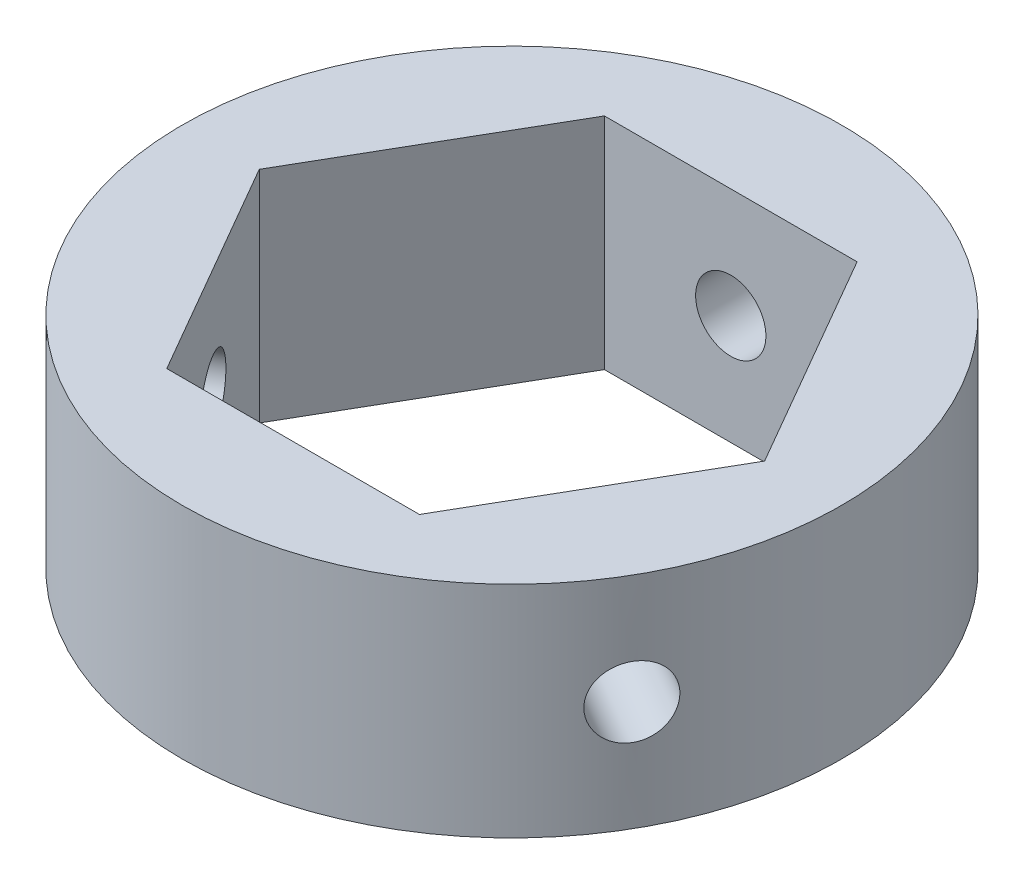
ISO-10303-21;
HEADER;
FILE_DESCRIPTION(('STEP AP214'),'2;1');
FILE_NAME('part.step','',(''),(''),'','','');
FILE_SCHEMA(('AUTOMOTIVE_DESIGN { 1 0 10303 214 1 1 1 1 }'));
ENDSEC;
DATA;
#1=APPLICATION_CONTEXT('core data for automotive mechanical design processes');
#2=APPLICATION_PROTOCOL_DEFINITION('international standard','automotive_design',2000,#1);
#3=PRODUCT_CONTEXT('',#1,'mechanical');
#4=PRODUCT('Part','Part','',(#3));
#5=PRODUCT_RELATED_PRODUCT_CATEGORY('part','',(#4));
#6=PRODUCT_DEFINITION_FORMATION('','',#4);
#7=PRODUCT_DEFINITION_CONTEXT('part definition',#1,'design');
#8=PRODUCT_DEFINITION('design','',#6,#7);
#9=PRODUCT_DEFINITION_SHAPE('','',#8);
#10=(LENGTH_UNIT() NAMED_UNIT(*) SI_UNIT(.MILLI.,.METRE.));
#11=(NAMED_UNIT(*) PLANE_ANGLE_UNIT() SI_UNIT($,.RADIAN.));
#12=(NAMED_UNIT(*) SI_UNIT($,.STERADIAN.) SOLID_ANGLE_UNIT());
#13=UNCERTAINTY_MEASURE_WITH_UNIT(LENGTH_MEASURE(1.E-05),#10,'distance_accuracy_value','');
#14=(GEOMETRIC_REPRESENTATION_CONTEXT(3) GLOBAL_UNCERTAINTY_ASSIGNED_CONTEXT((#13)) GLOBAL_UNIT_ASSIGNED_CONTEXT((#10,
#11,#12)) REPRESENTATION_CONTEXT('',''));
#15=CARTESIAN_POINT('',(0.,0.,0.));
#16=DIRECTION('',(0.,0.,1.));
#17=DIRECTION('',(1.,0.,0.));
#18=AXIS2_PLACEMENT_3D('',#15,#16,#17);
#19=CARTESIAN_POINT('',(0.,10.,0.));
#20=DIRECTION('',(0.,-1.,0.));
#21=DIRECTION('',(0.,0.,-1.));
#22=AXIS2_PLACEMENT_3D('',#19,#20,#21);
#23=CYLINDRICAL_SURFACE('',#22,15.);
#24=CARTESIAN_POINT('',(13.716268811077,5.,6.0715706289457));
#25=CARTESIAN_POINT('',(13.7162678447554,4.91040200902519,6.07157453384681));
#26=CARTESIAN_POINT('',(13.7131998564536,4.82074556882255,6.07851839780112));
#27=CARTESIAN_POINT('',(13.7009495137309,4.64392074417291,6.1060790255386));
#28=CARTESIAN_POINT('',(13.6917605065222,4.55675517461343,6.12671066613786));
#29=CARTESIAN_POINT('',(13.6673660215571,4.38749824849863,6.18093718497508));
#30=CARTESIAN_POINT('',(13.6521642978678,4.30540376269536,6.21452397428277));
#31=CARTESIAN_POINT('',(13.6159189937219,4.14855476135986,6.29353876970057));
#32=CARTESIAN_POINT('',(13.5948765337103,4.07379884176919,6.33896450461022));
#33=CARTESIAN_POINT('',(13.5471271319455,3.93342415971157,6.44037964868157));
#34=CARTESIAN_POINT('',(13.5203997101253,3.86783989326222,6.49640716797559));
#35=CARTESIAN_POINT('',(13.4617197722796,3.74796750526414,6.6171441528138));
#36=CARTESIAN_POINT('',(13.4297670123153,3.69367991135629,6.68185402365803));
#37=CARTESIAN_POINT('',(13.361106525374,3.59782135699573,6.81811246067042));
#38=CARTESIAN_POINT('',(13.3243876072305,3.55628112565101,6.88967701490332));
#39=CARTESIAN_POINT('',(13.2470012907982,3.48729311061391,7.03732165788264));
#40=CARTESIAN_POINT('',(13.206334001071,3.45984493958605,7.11340162245401));
#41=CARTESIAN_POINT('',(13.1221663194097,3.41992191766823,7.26749094433223));
#42=CARTESIAN_POINT('',(13.0786773587645,3.40739019689065,7.34549180886586));
#43=CARTESIAN_POINT('',(12.9898736360621,3.397479769565,7.50141524379234));
#44=CARTESIAN_POINT('',(12.9445589273987,3.4001006202012,7.57933781640661));
#45=CARTESIAN_POINT('',(12.8536077719863,3.42037492014872,7.7325724190174));
#46=CARTESIAN_POINT('',(12.8079733820495,3.43796721522681,7.80789377370764));
#47=CARTESIAN_POINT('',(12.7176249700482,3.48758967293255,7.95420725275729));
#48=CARTESIAN_POINT('',(12.672910961347,3.51962004503983,8.02519931428675));
#49=CARTESIAN_POINT('',(12.5858018570609,3.59727598788733,8.16113525572931));
#50=CARTESIAN_POINT('',(12.5434115508407,3.6429284735851,8.22606682456891));
#51=CARTESIAN_POINT('',(12.4625322678048,3.74651318645469,8.34809299554531));
#52=CARTESIAN_POINT('',(12.4240434213304,3.80444582368619,8.40518733587591));
#53=CARTESIAN_POINT('',(12.3522031359487,3.93128993430478,8.51041512827645));
#54=CARTESIAN_POINT('',(12.3188782282477,4.00025463118204,8.55850255231713));
#55=CARTESIAN_POINT('',(12.2588898879862,4.14702109423084,8.64420986264528));
#56=CARTESIAN_POINT('',(12.232226467408,4.22482287629787,8.68182973010406));
#57=CARTESIAN_POINT('',(12.186632030043,4.38709742349062,8.74571598596297));
#58=CARTESIAN_POINT('',(12.1677030002245,4.47157189619066,8.77197945700068));
#59=CARTESIAN_POINT('',(12.138380554958,4.64477265013014,8.81251093145445));
#60=CARTESIAN_POINT('',(12.1279868427585,4.73349878343654,8.82677935190861));
#61=CARTESIAN_POINT('',(12.1162090422473,4.91221716228972,8.84293954436857));
#62=CARTESIAN_POINT('',(12.1147809025209,5.00220103666887,8.84489183066064));
#63=CARTESIAN_POINT('',(12.1208780415679,5.18129044153566,8.83653445686697));
#64=CARTESIAN_POINT('',(12.1284031823582,5.27039598553831,8.82622498575285));
#65=CARTESIAN_POINT('',(12.1520564259819,5.44498090027206,8.79362975919915));
#66=CARTESIAN_POINT('',(12.1681637720459,5.53046848511789,8.77137289853734));
#67=CARTESIAN_POINT('',(12.2082976965739,5.695646532303,8.71542573010759));
#68=CARTESIAN_POINT('',(12.2323244805376,5.77533684414467,8.68173512564739));
#69=CARTESIAN_POINT('',(12.2874353145018,5.9269968830581,8.60355861096544));
#70=CARTESIAN_POINT('',(12.3185463044659,5.99893555228141,8.55903144559601));
#71=CARTESIAN_POINT('',(12.3865581327926,6.13273480729651,8.46030504996526));
#72=CARTESIAN_POINT('',(12.4234591344025,6.1945951088323,8.40610554699015));
#73=CARTESIAN_POINT('',(12.5018313847431,6.30673949726983,8.28910012833038));
#74=CARTESIAN_POINT('',(12.543320801138,6.35697494034909,8.22625974190163));
#75=CARTESIAN_POINT('',(12.6292480487266,6.44410842820421,8.09372118645029));
#76=CARTESIAN_POINT('',(12.6736858347137,6.48100667742005,8.02402312256686));
#77=CARTESIAN_POINT('',(12.7638933041883,6.54033646050466,7.87973642057734));
#78=CARTESIAN_POINT('',(12.8096601163803,6.56279706220758,7.80515794424808));
#79=CARTESIAN_POINT('',(12.9011333690097,6.59270877323548,7.65301459820634));
#80=CARTESIAN_POINT('',(12.9468398113466,6.60016036667508,7.57544982489894));
#81=CARTESIAN_POINT('',(13.0365978415722,6.5998351884965,7.41991505653984));
#82=CARTESIAN_POINT('',(13.0806565161107,6.59213380438842,7.3419489825624));
#83=CARTESIAN_POINT('',(13.1661646534449,6.56187975717421,7.18748247547159));
#84=CARTESIAN_POINT('',(13.2076141150085,6.53932708705545,7.11098204305029));
#85=CARTESIAN_POINT('',(13.2868961989133,6.48003225255141,6.96171930471675));
#86=CARTESIAN_POINT('',(13.3247294724526,6.44329264895786,6.88895632686478));
#87=CARTESIAN_POINT('',(13.3959919699902,6.35667477609158,6.74933702674084));
#88=CARTESIAN_POINT('',(13.4294212003003,6.30679652564899,6.68248069600373));
#89=CARTESIAN_POINT('',(13.4914206597889,6.1950352504844,6.55641177052307));
#90=CARTESIAN_POINT('',(13.5199669329959,6.13309605795611,6.49723718624372));
#91=CARTESIAN_POINT('',(13.5715668310967,5.99908402620221,6.38875514320365));
#92=CARTESIAN_POINT('',(13.5946191410206,5.92700876747841,6.33945004713811));
#93=CARTESIAN_POINT('',(13.6349715382365,5.77454180865087,6.25218969922929));
#94=CARTESIAN_POINT('',(13.6522550088522,5.69412694429036,6.21426726529693));
#95=CARTESIAN_POINT('',(13.6807605469919,5.5274798834738,6.15125984298096));
#96=CARTESIAN_POINT('',(13.6919893923532,5.4412543140037,6.12616050147389));
#97=CARTESIAN_POINT('',(13.7055088194197,5.2954586152445,6.09583396911073));
#98=CARTESIAN_POINT('',(13.7095413440927,5.23681777309935,6.08674960461534));
#99=CARTESIAN_POINT('',(13.7149216536417,5.11879318406104,6.07461665487275));
#100=CARTESIAN_POINT('',(13.7162694518126,5.05940944084826,6.07156803973596));
#101=CARTESIAN_POINT('',(13.716268811077,5.,6.0715706289457));
#102=B_SPLINE_CURVE_WITH_KNOTS('',3,(#24,#25,#26,#27,#28,#29,#30,#31,#32,#33,#34,#35,#36,#37,
#38,#39,#40,#41,#42,#43,#44,#45,#46,#47,#48,#49,#50,#51,#52,#53,#54,#55,#56,#57,#58,#59,#60,#61,
#62,#63,#64,#65,#66,#67,#68,#69,#70,#71,#72,#73,#74,#75,#76,#77,#78,#79,#80,#81,#82,#83,#84,#85,
#86,#87,#88,#89,#90,#91,#92,#93,#94,#95,#96,#97,#98,#99,#100,#101),.UNSPECIFIED.,.T.,.F.,(4,2,2,
2,2,2,2,2,2,2,2,2,2,2,2,2,2,2,2,2,2,2,2,2,2,2,2,2,2,2,2,2,2,2,2,2,2,2,4),(0.,0.268577001529121,
0.537446390261957,0.806148173479048,1.07479844645295,1.34443343913402,1.61408102300266,
1.88437361023824,2.15465876779301,2.42391011167974,2.69315358705865,2.96130252668384,
3.2294553569622,3.49814155961668,3.76683673567384,4.0368696427364,4.30690303552162,
4.57700575645424,4.84709908619821,5.11586429481954,5.3846253614294,5.65273933841568,
5.92086027317745,6.19001837516277,6.45918406732221,6.72945648996834,6.99972476955155,
7.26944718972391,7.5391609098771,7.80753617116475,8.07591155917665,8.34423852710794,
8.6125651104786,8.88217254048791,9.15184443588202,9.42228652782288,9.69242524206734,
9.87051058001087,10.0485950360567),.UNSPECIFIED.);
#103=CARTESIAN_POINT('',(13.716268811077,5.,6.0715706289457));
#104=VERTEX_POINT('',#103);
#105=EDGE_CURVE('E157',#104,#104,#102,.T.);
#106=ORIENTED_EDGE('',*,*,#105,.T.);
#107=EDGE_LOOP('',(#106));
#108=FACE_BOUND('',#107,.T.);
#109=CARTESIAN_POINT('',(0.,6.6,-15.));
#110=CARTESIAN_POINT('',(-0.0895996258363296,6.59999613655217,-14.9999989077891));
#111=CARTESIAN_POINT('',(-0.179257695847454,6.59244831368327,-14.9991886728086));
#112=CARTESIAN_POINT('',(-0.356085906710567,6.56245378538801,-14.9960344014634));
#113=CARTESIAN_POINT('',(-0.443253233957272,6.53999087554986,-14.9936886969358));
#114=CARTESIAN_POINT('',(-0.612513877047086,6.48082951205622,-14.9877281443057));
#115=CARTESIAN_POINT('',(-0.694610307255972,6.44413989877648,-14.9841140844827));
#116=CARTESIAN_POINT('',(-0.851462567730018,6.3575843319251,-14.9760204055693));
#117=CARTESIAN_POINT('',(-0.926219804467191,6.30772090974961,-14.9715409528118));
#118=CARTESIAN_POINT('',(-1.06659300399931,6.19601574013731,-14.9621974912335));
#119=CARTESIAN_POINT('',(-1.13217488683966,6.13413127392194,-14.9573321486968));
#120=CARTESIAN_POINT('',(-1.25204267306383,6.00023200984404,-14.9477762215508));
#121=CARTESIAN_POINT('',(-1.30632804149334,5.92821673250043,-14.9430856452263));
#122=CARTESIAN_POINT('',(-1.40218426488646,5.77588453543441,-14.9343968648937));
#123=CARTESIAN_POINT('',(-1.44372398305559,5.69554791699697,-14.9304003666382));
#124=CARTESIAN_POINT('',(-1.51271092874899,5.52898979671223,-14.9235690950951));
#125=CARTESIAN_POINT('',(-1.5401585496526,5.44276845921236,-14.9207342893794));
#126=CARTESIAN_POINT('',(-1.58008042762114,5.26723776868191,-14.9165596344694));
#127=CARTESIAN_POINT('',(-1.59261150456498,5.17794147566983,-14.9152141136969));
#128=CARTESIAN_POINT('',(-1.6025202691514,4.99850383771656,-14.9141528417841));
#129=CARTESIAN_POINT('',(-1.59989840661938,4.90836251793988,-14.9144370422643));
#130=CARTESIAN_POINT('',(-1.57962250102191,4.7301863346092,-14.9165979183767));
#131=CARTESIAN_POINT('',(-1.56203063092426,4.64214430482136,-14.9184680074354));
#132=CARTESIAN_POINT('',(-1.51241088377974,4.47026943307365,-14.9235796666885));
#133=CARTESIAN_POINT('',(-1.48038278761355,4.38643665502511,-14.9268212577002));
#134=CARTESIAN_POINT('',(-1.40273156459364,4.22516438723151,-14.934318231731));
#135=CARTESIAN_POINT('',(-1.35708099297873,4.14773821074337,-14.9385756578166));
#136=CARTESIAN_POINT('',(-1.25350036927722,4.00162272366845,-14.9476229120459));
#137=CARTESIAN_POINT('',(-1.19556990805871,3.93293370430156,-14.9524127579258));
#138=CARTESIAN_POINT('',(-1.06872734530803,3.80588117566733,-14.9620144963827));
#139=CARTESIAN_POINT('',(-0.999761574904382,3.74757123241306,-14.9668263789258));
#140=CARTESIAN_POINT('',(-0.852992050794658,3.64334770283242,-14.9759073641043));
#141=CARTESIAN_POINT('',(-0.775188284988181,3.59743413347865,-14.9801764659965));
#142=CARTESIAN_POINT('',(-0.612913191276046,3.51930828319763,-14.9876925654949));
#143=CARTESIAN_POINT('',(-0.528440469342861,3.4870988759216,-14.9909393486921));
#144=CARTESIAN_POINT('',(-0.355243522280946,3.43733571215953,-14.9960428703375));
#145=CARTESIAN_POINT('',(-0.266519441977571,3.41978145681077,-14.997899656101));
#146=CARTESIAN_POINT('',(-0.087802032562715,3.39989521302742,-15.0000078792333));
#147=CARTESIAN_POINT('',(0.0021829870137167,3.39748933901274,-15.0002671084835));
#148=CARTESIAN_POINT('',(0.181274940101574,3.40777386604083,-14.999171939422));
#149=CARTESIAN_POINT('',(0.270381887120156,3.42046403449854,-14.9978175659711));
#150=CARTESIAN_POINT('',(0.444973854329872,3.4605191002134,-14.9936523243633));
#151=CARTESIAN_POINT('',(0.530466936374454,3.48784924657705,-14.9908449058284));
#152=CARTESIAN_POINT('',(0.695655329486703,3.55637265126685,-14.9840883583372));
#153=CARTESIAN_POINT('',(0.775350493687461,3.59756626061943,-14.9801392004722));
#154=CARTESIAN_POINT('',(0.927013863040388,3.69282939323977,-14.9715211164958));
#155=CARTESIAN_POINT('',(0.99895153717134,3.74694727694824,-14.9668495108193));
#156=CARTESIAN_POINT('',(1.13274844352509,3.86645363809374,-14.9573189019738));
#157=CARTESIAN_POINT('',(1.19460738709631,3.93184243821585,-14.9524598934425));
#158=CARTESIAN_POINT('',(1.30674880643155,4.07235764059253,-14.9430785249007));
#159=CARTESIAN_POINT('',(1.35698266951906,4.14752295105724,-14.9385576302351));
#160=CARTESIAN_POINT('',(1.44411338577527,4.30526636871053,-14.930387126785));
#161=CARTESIAN_POINT('',(1.48101044283187,4.38784436255281,-14.9267375046811));
#162=CARTESIAN_POINT('',(1.54033944502694,4.5579047716626,-14.9207321507796));
#163=CARTESIAN_POINT('',(1.56279994139129,4.64537713235757,-14.9183738664767));
#164=CARTESIAN_POINT('',(1.5927107304462,4.82287819210992,-14.915210437379));
#165=CARTESIAN_POINT('',(1.60016151850103,4.91290680670399,-14.9144052413278));
#166=CARTESIAN_POINT('',(1.59983397632685,5.09248152727686,-14.9144403420788));
#167=CARTESIAN_POINT('',(1.59213200890153,5.18202778389634,-14.9152723879508));
#168=CARTESIAN_POINT('',(1.56187808941871,5.35854626255166,-14.9184705939872));
#169=CARTESIAN_POINT('',(1.53932612386707,5.44551848224841,-14.9208367555458));
#170=CARTESIAN_POINT('',(1.48003415917889,5.61441712017421,-14.9268342337211));
#171=CARTESIAN_POINT('',(1.44329676336001,5.69634446104522,-14.9304653181866));
#172=CARTESIAN_POINT('',(1.35668450936541,5.85288272448499,-14.9385839617066));
#173=CARTESIAN_POINT('',(1.30680966569268,5.92749365513053,-14.9430715198156));
#174=CARTESIAN_POINT('',(1.19505215510916,6.06767240790912,-14.9524245860808));
#175=CARTESIAN_POINT('',(1.1331125400443,6.13319471474542,-14.9572918183519));
#176=CARTESIAN_POINT('',(0.999098641616504,6.25294766925808,-14.9668401736096));
#177=CARTESIAN_POINT('',(0.927021944358041,6.30717561981006,-14.9715212519268));
#178=CARTESIAN_POINT('',(0.774553795891812,6.4029240243546,-14.980183875197));
#179=CARTESIAN_POINT('',(0.694139439921302,6.44440816203731,-14.9841634074549));
#180=CARTESIAN_POINT('',(0.527493453773448,6.51322824269229,-14.9909531584395));
#181=CARTESIAN_POINT('',(0.441268447110539,6.54057999670216,-14.993764683217));
#182=CARTESIAN_POINT('',(0.295470974664233,6.5736051144877,-14.99720217104));
#183=CARTESIAN_POINT('',(0.23682766491673,6.58348950307229,-14.9982464112777));
#184=CARTESIAN_POINT('',(0.118798133247348,6.59668821077964,-14.9996456861983));
#185=CARTESIAN_POINT('',(0.0594119149318298,6.6000025617834,-15.0000007242256));
#186=CARTESIAN_POINT('',(0.,6.6,-15.));
#187=B_SPLINE_CURVE_WITH_KNOTS('',3,(#109,#110,#111,#112,#113,#114,#115,#116,#117,#118,#119,
#120,#121,#122,#123,#124,#125,#126,#127,#128,#129,#130,#131,#132,#133,#134,#135,#136,#137,#138,
#139,#140,#141,#142,#143,#144,#145,#146,#147,#148,#149,#150,#151,#152,#153,#154,#155,#156,#157,
#158,#159,#160,#161,#162,#163,#164,#165,#166,#167,#168,#169,#170,#171,#172,#173,#174,#175,#176,
#177,#178,#179,#180,#181,#182,#183,#184,#185,#186),.UNSPECIFIED.,.T.,.F.,(4,2,2,2,2,2,2,2,2,2,2,
2,2,2,2,2,2,2,2,2,2,2,2,2,2,2,2,2,2,2,2,2,2,2,2,2,2,2,4),(0.,0.268581912434583,
0.537456102668156,0.80616348338273,1.07481926848528,1.3444478343109,1.61408916568093,
1.88438406286665,2.15467141438986,2.42392586261099,2.69317231787025,2.96130597431384,
3.22944370074354,3.49812532525549,3.76681590290194,4.03685533070423,4.30689512823114,
4.57699152303085,4.84707872334928,5.11584755786575,5.38461225150832,5.65274178759604,
5.92087811330302,6.19003392913605,6.45919745215019,6.72946698035851,6.99973237661693,
7.26946161011746,7.53918194161856,7.80754649023397,8.07591128271147,8.34422684813032,
8.61254211734561,8.88215600074883,9.15183419507823,9.42227391655059,9.69241041656318,
9.87050315987931,10.048595039001),.UNSPECIFIED.);
#188=CARTESIAN_POINT('',(0.,6.6,-15.));
#189=VERTEX_POINT('',#188);
#190=EDGE_CURVE('E154',#189,#189,#187,.T.);
#191=ORIENTED_EDGE('',*,*,#190,.T.);
#192=EDGE_LOOP('',(#191));
#193=FACE_BOUND('',#192,.T.);
#194=CARTESIAN_POINT('',(-12.116268811077,5.,8.84285192105596));
#195=CARTESIAN_POINT('',(-12.1162717096598,4.91040200902519,8.84284913174639));
#196=CARTESIAN_POINT('',(-12.1207512780937,4.82074556882255,8.8367202439613));
#197=CARTESIAN_POINT('',(-12.1384943104973,4.64392074417291,8.81233082208968));
#198=CARTESIAN_POINT('',(-12.1517673317736,4.55675517461343,8.79405708811171));
#199=CARTESIAN_POINT('',(-12.1865316321629,4.38749824849863,8.74581758500109));
#200=CARTESIAN_POINT('',(-12.2080177830903,4.30540376269536,8.71585911145105));
#201=CARTESIAN_POINT('',(-12.258323951124,4.14855476135986,8.64496235958389));
#202=CARTESIAN_POINT('',(-12.2871425615355,4.07379884176919,8.60402618720085));
#203=CARTESIAN_POINT('',(-12.3510959517473,3.93342415971157,8.51196642022142));
#204=CARTESIAN_POINT('',(-12.3862534958569,3.86783989326222,8.46080603430044));
#205=CARTESIAN_POINT('',(-12.4614748229802,3.74796750526414,8.34961922501444));
#206=CARTESIAN_POINT('',(-12.5015388350248,3.69367991135629,8.28959238774224));
#207=CARTESIAN_POINT('',(-12.5852118594869,3.59782135699573,8.16200144330867));
#208=CARTESIAN_POINT('',(-12.6288291223913,3.55628112565101,8.09441965028048));
#209=CARTESIAN_POINT('',(-12.7179999757279,3.48729311061391,7.95357881285507));
#210=CARTESIAN_POINT('',(-12.7635535129022,3.45984493958606,7.88031992456264));
#211=CARTESIAN_POINT('',(-12.8549149392699,3.41992191766823,7.73038391312715));
#212=CARTESIAN_POINT('',(-12.9007211891506,3.40739019689065,7.6537209361574));
#213=CARTESIAN_POINT('',(-12.9913529834911,3.397479769565,7.49885293888328));
#214=CARTESIAN_POINT('',(-13.0361785565716,3.4001006202012,7.42064796370853));
#215=CARTESIAN_POINT('',(-13.1234080374651,3.42037492014872,7.26526465131247));
#216=CARTESIAN_POINT('',(-13.165821049106,3.43796721522682,7.18808343299591));
#217=CARTESIAN_POINT('',(-13.2473580328784,3.48758967293255,7.0366826734863));
#218=CARTESIAN_POINT('',(-13.2864819572793,3.51962004503983,6.96246317528137));
#219=CARTESIAN_POINT('',(-13.3606513837129,3.59727598788733,6.81905650734735));
#220=CARTESIAN_POINT('',(-13.3956886187254,3.6429284735851,6.74987964086667));
#221=CARTESIAN_POINT('',(-13.4609267411996,3.74651318645469,6.61882304162953));
#222=CARTESIAN_POINT('',(-13.491127467101,3.80444582368619,6.55694355265504));
#223=CARTESIAN_POINT('',(-13.5463372658132,3.93128993430478,6.44211414429908));
#224=CARTESIAN_POINT('',(-13.5713197427845,4.00025463118204,6.38921021563094));
#225=CARTESIAN_POINT('',(-13.6155502806879,4.14702109423084,6.29440513386949));
#226=CARTESIAN_POINT('',(-13.6347983313051,4.22482287629787,6.25250400056764));
#227=CARTESIAN_POINT('',(-13.6673282331491,4.38709742349062,6.18107493160881));
#228=CARTESIAN_POINT('',(-13.6806085513501,4.47157189619066,6.15155017539815));
#229=CARTESIAN_POINT('',(-13.7010486152467,4.64477265013014,6.1058904556694));
#230=CARTESIAN_POINT('',(-13.7082085737321,4.73349878343654,6.08975502663792));
#231=CARTESIAN_POINT('',(-13.7163148106769,4.91221716228972,6.07147505596456));
#232=CARTESIAN_POINT('',(-13.717291470338,5.00220103666887,6.06926210753527));
#233=CARTESIAN_POINT('',(-13.7131023418473,5.18129044153566,6.0787210717372));
#234=CARTESIAN_POINT('',(-13.707936648358,5.27039598553832,6.0903927703857));
#235=CARTESIAN_POINT('',(-13.6915349759323,5.44498090027206,6.12717469352261));
#236=CARTESIAN_POINT('',(-13.6803136422226,5.53046848511789,6.15225249473247));
#237=CARTESIAN_POINT('',(-13.6519289353567,5.695646532303,6.2149830771422));
#238=CARTESIAN_POINT('',(-13.6347654080072,5.77533684414467,6.25263618465613));
#239=CARTESIAN_POINT('',(-13.5946179772953,5.9269968830581,6.33945182423378));
#240=CARTESIAN_POINT('',(-13.5716118159089,5.99893555228141,6.38865831456428));
#241=CARTESIAN_POINT('',(-13.520118163432,6.13273480729651,6.49692148346848));
#242=CARTESIAN_POINT('',(-13.491630517788,6.1945951088323,6.55597843977527));
#243=CARTESIAN_POINT('',(-13.4294869780185,6.30673949726983,6.68235350885186));
#244=CARTESIAN_POINT('',(-13.3958103151851,6.35697494034909,6.74970459065241));
#245=CARTESIAN_POINT('',(-13.3239921829776,6.44410842820421,6.89038904766709));
#246=CARTESIAN_POINT('',(-13.2858507820535,6.48100667742005,6.96372233116155));
#247=CARTESIAN_POINT('',(-13.2059985674396,6.54033646050466,7.11398764233242));
#248=CARTESIAN_POINT('',(-13.164295118459,6.56279706220758,7.1909121025056));
#249=CARTESIAN_POINT('',(-13.0782717420847,6.59270877323548,7.34620193607026));
#250=CARTESIAN_POINT('',(-13.0339518991302,6.60016036667508,7.4245672629044));
#251=CARTESIAN_POINT('',(-12.9441338536723,6.5998351884965,7.58006738145293));
#252=CARTESIAN_POINT('',(-12.8986425902438,6.59213380438842,7.6572063498491));
#253=CARTESIAN_POINT('',(-12.8076247397364,6.56187975717421,7.8084918225562));
#254=CARTESIAN_POINT('',(-12.7620981526408,6.53932708705544,7.88263832545411));
#255=CARTESIAN_POINT('',(-12.6724738713579,6.4800322525514,8.02592999334737));
#256=CARTESIAN_POINT('',(-12.6283759208528,6.44329264895786,8.09507605826671));
#257=CARTESIAN_POINT('',(-12.5430933088557,6.35667477609158,8.22660084153342));
#258=CARTESIAN_POINT('',(-12.5019086431885,6.30679652564899,8.28897956957946));
#259=CARTESIAN_POINT('',(-12.4237294808388,6.1950352504844,8.40570713925781));
#260=CARTESIAN_POINT('',(-12.386755924198,6.13309605795611,8.46001622917809));
#261=CARTESIAN_POINT('',(-12.3186076681213,5.99908402620221,8.55894407328617));
#262=CARTESIAN_POINT('',(-12.2874343573544,5.92700876747841,8.60356050732888));
#263=CARTESIAN_POINT('',(-12.2320408779303,5.77454180865086,8.68213688237593));
#264=CARTESIAN_POINT('',(-12.2078408220793,5.69412694429036,8.71606602396085));
#265=CARTESIAN_POINT('',(-12.1675275627966,5.52747988347379,8.7722562552963));
#266=CARTESIAN_POINT('',(-12.1514053181138,5.4412543140037,8.79453039138793));
#267=CARTESIAN_POINT('',(-12.1319014842119,5.2954586152445,8.82140182485374));
#268=CARTESIAN_POINT('',(-12.1260504561182,5.23681777309935,8.82943627590964));
#269=CARTESIAN_POINT('',(-12.1182331681927,5.11879318406104,8.84016223553054));
#270=CARTESIAN_POINT('',(-12.1162668891234,5.05940944084826,8.84285377055415));
#271=CARTESIAN_POINT('',(-12.116268811077,5.,8.84285192105596));
#272=B_SPLINE_CURVE_WITH_KNOTS('',3,(#194,#195,#196,#197,#198,#199,#200,#201,#202,#203,#204,
#205,#206,#207,#208,#209,#210,#211,#212,#213,#214,#215,#216,#217,#218,#219,#220,#221,#222,#223,
#224,#225,#226,#227,#228,#229,#230,#231,#232,#233,#234,#235,#236,#237,#238,#239,#240,#241,#242,
#243,#244,#245,#246,#247,#248,#249,#250,#251,#252,#253,#254,#255,#256,#257,#258,#259,#260,#261,
#262,#263,#264,#265,#266,#267,#268,#269,#270,#271),.UNSPECIFIED.,.T.,.F.,(4,2,2,2,2,2,2,2,2,2,2,
2,2,2,2,2,2,2,2,2,2,2,2,2,2,2,2,2,2,2,2,2,2,2,2,2,2,2,4),(0.,0.268577001529121,
0.537446390261957,0.806148173479049,1.07479844645295,1.34443343913402,1.61408102300266,
1.88437361023824,2.15465876779301,2.42391011167974,2.69315358705865,2.96130252668384,
3.2294553569622,3.49814155961668,3.76683673567384,4.0368696427364,4.30690303552162,
4.57700575645424,4.84709908619821,5.11586429481954,5.3846253614294,5.65273933841568,
5.92086027317745,6.19001837516276,6.45918406732221,6.72945648996834,6.99972476955155,
7.26944718972391,7.5391609098771,7.80753617116475,8.07591155917665,8.34423852710794,
8.6125651104786,8.88217254048791,9.15184443588201,9.42228652782288,9.69242524206733,
9.87051058001086,10.0485950360567),.UNSPECIFIED.);
#273=CARTESIAN_POINT('',(-12.116268811077,5.,8.84285192105596));
#274=VERTEX_POINT('',#273);
#275=EDGE_CURVE('E116',#274,#274,#272,.T.);
#276=ORIENTED_EDGE('',*,*,#275,.T.);
#277=EDGE_LOOP('',(#276));
#278=FACE_BOUND('',#277,.T.);
#279=CARTESIAN_POINT('',(0.,10.,0.));
#280=DIRECTION('',(0.,1.,0.));
#281=DIRECTION('',(0.,0.,1.));
#282=AXIS2_PLACEMENT_3D('',#279,#280,#281);
#283=CIRCLE('',#282,15.);
#284=CARTESIAN_POINT('',(0.,10.,15.));
#285=VERTEX_POINT('',#284);
#286=EDGE_CURVE('E11',#285,#285,#283,.T.);
#287=ORIENTED_EDGE('',*,*,#286,.F.);
#288=EDGE_LOOP('',(#287));
#289=FACE_BOUND('',#288,.T.);
#290=CARTESIAN_POINT('',(0.,0.,0.));
#291=DIRECTION('',(0.,1.,0.));
#292=DIRECTION('',(0.,0.,1.));
#293=AXIS2_PLACEMENT_3D('',#290,#291,#292);
#294=CIRCLE('',#293,15.);
#295=CARTESIAN_POINT('',(0.,0.,15.));
#296=VERTEX_POINT('',#295);
#297=EDGE_CURVE('E45',#296,#296,#294,.T.);
#298=ORIENTED_EDGE('',*,*,#297,.T.);
#299=EDGE_LOOP('',(#298));
#300=FACE_BOUND('',#299,.T.);
#301=ADVANCED_FACE('F36',(#108,#193,#278,#289,#300),#23,.T.);
#302=CARTESIAN_POINT('',(0.,10.,0.));
#303=DIRECTION('',(0.,1.,0.));
#304=DIRECTION('',(0.,0.,1.));
#305=AXIS2_PLACEMENT_3D('',#302,#303,#304);
#306=PLANE('',#305);
#307=DIRECTION('',(-1.,0.,0.));
#308=VECTOR('',#307,1.);
#309=CARTESIAN_POINT('',(5.75,10.,-9.95929214352105));
#310=LINE('',#309,#308);
#311=CARTESIAN_POINT('',(5.75,10.,-9.95929214352105));
#312=VERTEX_POINT('',#311);
#313=CARTESIAN_POINT('',(-5.75,10.,-9.95929214352105));
#314=VERTEX_POINT('',#313);
#315=EDGE_CURVE('E53',#312,#314,#310,.T.);
#316=ORIENTED_EDGE('',*,*,#315,.F.);
#317=DIRECTION('',(-0.5,0.,-0.866025403784439));
#318=VECTOR('',#317,1.);
#319=CARTESIAN_POINT('',(11.5,10.,0.));
#320=LINE('',#319,#318);
#321=CARTESIAN_POINT('',(11.5,10.,0.));
#322=VERTEX_POINT('',#321);
#323=EDGE_CURVE('E110',#322,#312,#320,.T.);
#324=ORIENTED_EDGE('',*,*,#323,.F.);
#325=DIRECTION('',(0.5,0.,-0.866025403784439));
#326=VECTOR('',#325,1.);
#327=CARTESIAN_POINT('',(5.75,10.,9.95929214352105));
#328=LINE('',#327,#326);
#329=CARTESIAN_POINT('',(5.75,10.,9.95929214352105));
#330=VERTEX_POINT('',#329);
#331=EDGE_CURVE('E113',#330,#322,#328,.T.);
#332=ORIENTED_EDGE('',*,*,#331,.F.);
#333=DIRECTION('',(1.,0.,0.));
#334=VECTOR('',#333,1.);
#335=CARTESIAN_POINT('',(-5.75,10.,9.95929214352105));
#336=LINE('',#335,#334);
#337=CARTESIAN_POINT('',(-5.75,10.,9.95929214352105));
#338=VERTEX_POINT('',#337);
#339=EDGE_CURVE('E136',#338,#330,#336,.T.);
#340=ORIENTED_EDGE('',*,*,#339,.F.);
#341=DIRECTION('',(0.5,0.,0.866025403784439));
#342=VECTOR('',#341,1.);
#343=CARTESIAN_POINT('',(-11.5,10.,0.));
#344=LINE('',#343,#342);
#345=CARTESIAN_POINT('',(-11.5,10.,0.));
#346=VERTEX_POINT('',#345);
#347=EDGE_CURVE('E133',#346,#338,#344,.T.);
#348=ORIENTED_EDGE('',*,*,#347,.F.);
#349=DIRECTION('',(-0.5,0.,0.866025403784439));
#350=VECTOR('',#349,1.);
#351=CARTESIAN_POINT('',(-5.75,10.,-9.95929214352105));
#352=LINE('',#351,#350);
#353=EDGE_CURVE('E131',#314,#346,#352,.T.);
#354=ORIENTED_EDGE('',*,*,#353,.F.);
#355=EDGE_LOOP('',(#316,#324,#332,#340,#348,#354));
#356=FACE_BOUND('',#355,.T.);
#357=ORIENTED_EDGE('',*,*,#286,.T.);
#358=EDGE_LOOP('',(#357));
#359=FACE_BOUND('',#358,.T.);
#360=ADVANCED_FACE('F206',(#356,#359),#306,.T.);
#361=CARTESIAN_POINT('',(0.,0.,0.));
#362=DIRECTION('',(0.,1.,0.));
#363=DIRECTION('',(0.,0.,1.));
#364=AXIS2_PLACEMENT_3D('',#361,#362,#363);
#365=PLANE('',#364);
#366=DIRECTION('',(-0.5,0.,-0.866025403784439));
#367=VECTOR('',#366,1.);
#368=CARTESIAN_POINT('',(11.5,0.,0.));
#369=LINE('',#368,#367);
#370=CARTESIAN_POINT('',(11.5,0.,0.));
#371=VERTEX_POINT('',#370);
#372=CARTESIAN_POINT('',(5.75,0.,-9.95929214352105));
#373=VERTEX_POINT('',#372);
#374=EDGE_CURVE('E99',#371,#373,#369,.T.);
#375=ORIENTED_EDGE('',*,*,#374,.T.);
#376=DIRECTION('',(-1.,0.,0.));
#377=VECTOR('',#376,1.);
#378=CARTESIAN_POINT('',(5.75,0.,-9.95929214352105));
#379=LINE('',#378,#377);
#380=CARTESIAN_POINT('',(-5.75,0.,-9.95929214352105));
#381=VERTEX_POINT('',#380);
#382=EDGE_CURVE('E93',#373,#381,#379,.T.);
#383=ORIENTED_EDGE('',*,*,#382,.T.);
#384=DIRECTION('',(-0.5,0.,0.866025403784439));
#385=VECTOR('',#384,1.);
#386=CARTESIAN_POINT('',(-5.75,0.,-9.95929214352105));
#387=LINE('',#386,#385);
#388=CARTESIAN_POINT('',(-11.5,0.,0.));
#389=VERTEX_POINT('',#388);
#390=EDGE_CURVE('E102',#381,#389,#387,.T.);
#391=ORIENTED_EDGE('',*,*,#390,.T.);
#392=DIRECTION('',(0.5,0.,0.866025403784439));
#393=VECTOR('',#392,1.);
#394=CARTESIAN_POINT('',(-11.5,0.,0.));
#395=LINE('',#394,#393);
#396=CARTESIAN_POINT('',(-5.75,0.,9.95929214352105));
#397=VERTEX_POINT('',#396);
#398=EDGE_CURVE('E61',#389,#397,#395,.T.);
#399=ORIENTED_EDGE('',*,*,#398,.T.);
#400=DIRECTION('',(1.,0.,0.));
#401=VECTOR('',#400,1.);
#402=CARTESIAN_POINT('',(-5.75,0.,9.95929214352105));
#403=LINE('',#402,#401);
#404=CARTESIAN_POINT('',(5.75,0.,9.95929214352105));
#405=VERTEX_POINT('',#404);
#406=EDGE_CURVE('E124',#397,#405,#403,.T.);
#407=ORIENTED_EDGE('',*,*,#406,.T.);
#408=DIRECTION('',(0.5,0.,-0.866025403784439));
#409=VECTOR('',#408,1.);
#410=CARTESIAN_POINT('',(5.75,0.,9.95929214352105));
#411=LINE('',#410,#409);
#412=EDGE_CURVE('E127',#405,#371,#411,.T.);
#413=ORIENTED_EDGE('',*,*,#412,.T.);
#414=EDGE_LOOP('',(#375,#383,#391,#399,#407,#413));
#415=FACE_BOUND('',#414,.T.);
#416=ORIENTED_EDGE('',*,*,#297,.F.);
#417=EDGE_LOOP('',(#416));
#418=FACE_BOUND('',#417,.T.);
#419=ADVANCED_FACE('F106',(#415,#418),#365,.F.);
#420=CARTESIAN_POINT('',(5.75,0.,-9.95929214352105));
#421=DIRECTION('',(0.,0.,-1.));
#422=DIRECTION('',(-1.,0.,0.));
#423=AXIS2_PLACEMENT_3D('',#420,#421,#422);
#424=PLANE('',#423);
#425=CARTESIAN_POINT('',(0.,5.,-9.95929214352105));
#426=DIRECTION('',(0.,0.,-1.));
#427=DIRECTION('',(-1.,0.,0.));
#428=AXIS2_PLACEMENT_3D('',#425,#426,#427);
#429=CIRCLE('',#428,1.6);
#430=CARTESIAN_POINT('',(-1.60000000000009,5.,-9.95929214352105));
#431=VERTEX_POINT('',#430);
#432=EDGE_CURVE('E40',#431,#431,#429,.T.);
#433=ORIENTED_EDGE('',*,*,#432,.T.);
#434=EDGE_LOOP('',(#433));
#435=FACE_BOUND('',#434,.T.);
#436=ORIENTED_EDGE('',*,*,#315,.T.);
#437=DIRECTION('',(0.,1.,0.));
#438=VECTOR('',#437,1.);
#439=CARTESIAN_POINT('',(-5.75,0.,-9.95929214352105));
#440=LINE('',#439,#438);
#441=EDGE_CURVE('E89',#381,#314,#440,.T.);
#442=ORIENTED_EDGE('',*,*,#441,.F.);
#443=ORIENTED_EDGE('',*,*,#382,.F.);
#444=DIRECTION('',(0.,1.,0.));
#445=VECTOR('',#444,1.);
#446=CARTESIAN_POINT('',(5.75,0.,-9.95929214352105));
#447=LINE('',#446,#445);
#448=EDGE_CURVE('E141',#373,#312,#447,.T.);
#449=ORIENTED_EDGE('',*,*,#448,.T.);
#450=EDGE_LOOP('',(#436,#442,#443,#449));
#451=FACE_BOUND('',#450,.T.);
#452=ADVANCED_FACE('F91',(#435,#451),#424,.F.);
#453=CARTESIAN_POINT('',(11.5,0.,0.));
#454=DIRECTION('',(0.866025403784438,0.,-0.5));
#455=DIRECTION('',(-0.5,0.,-0.866025403784439));
#456=AXIS2_PLACEMENT_3D('',#453,#454,#455);
#457=PLANE('',#456);
#458=ORIENTED_EDGE('',*,*,#323,.T.);
#459=ORIENTED_EDGE('',*,*,#448,.F.);
#460=ORIENTED_EDGE('',*,*,#374,.F.);
#461=DIRECTION('',(0.,1.,0.));
#462=VECTOR('',#461,1.);
#463=CARTESIAN_POINT('',(11.5,0.,0.));
#464=LINE('',#463,#462);
#465=EDGE_CURVE('E143',#371,#322,#464,.T.);
#466=ORIENTED_EDGE('',*,*,#465,.T.);
#467=EDGE_LOOP('',(#458,#459,#460,#466));
#468=FACE_BOUND('',#467,.T.);
#469=ADVANCED_FACE('F186',(#468),#457,.F.);
#470=CARTESIAN_POINT('',(5.75,0.,9.95929214352105));
#471=DIRECTION('',(0.866025403784439,0.,0.5));
#472=DIRECTION('',(0.5,0.,-0.866025403784439));
#473=AXIS2_PLACEMENT_3D('',#470,#471,#472);
#474=PLANE('',#473);
#475=CARTESIAN_POINT('',(8.62500000000002,5.,4.97964607176049));
#476=DIRECTION('',(0.866025403784439,0.,0.5));
#477=DIRECTION('',(0.5,0.,-0.866025403784439));
#478=AXIS2_PLACEMENT_3D('',#475,#476,#477);
#479=CIRCLE('',#478,1.6);
#480=CARTESIAN_POINT('',(9.42500000000002,5.,3.59400542570538));
#481=VERTEX_POINT('',#480);
#482=EDGE_CURVE('E155',#481,#481,#479,.T.);
#483=ORIENTED_EDGE('',*,*,#482,.T.);
#484=EDGE_LOOP('',(#483));
#485=FACE_BOUND('',#484,.T.);
#486=ORIENTED_EDGE('',*,*,#331,.T.);
#487=ORIENTED_EDGE('',*,*,#465,.F.);
#488=ORIENTED_EDGE('',*,*,#412,.F.);
#489=DIRECTION('',(0.,1.,0.));
#490=VECTOR('',#489,1.);
#491=CARTESIAN_POINT('',(5.75,0.,9.95929214352105));
#492=LINE('',#491,#490);
#493=EDGE_CURVE('E145',#405,#330,#492,.T.);
#494=ORIENTED_EDGE('',*,*,#493,.T.);
#495=EDGE_LOOP('',(#486,#487,#488,#494));
#496=FACE_BOUND('',#495,.T.);
#497=ADVANCED_FACE('F189',(#485,#496),#474,.F.);
#498=CARTESIAN_POINT('',(-5.75,0.,9.95929214352105));
#499=DIRECTION('',(0.,0.,1.));
#500=DIRECTION('',(1.,0.,0.));
#501=AXIS2_PLACEMENT_3D('',#498,#499,#500);
#502=PLANE('',#501);
#503=ORIENTED_EDGE('',*,*,#339,.T.);
#504=ORIENTED_EDGE('',*,*,#493,.F.);
#505=ORIENTED_EDGE('',*,*,#406,.F.);
#506=DIRECTION('',(0.,1.,0.));
#507=VECTOR('',#506,1.);
#508=CARTESIAN_POINT('',(-5.75,0.,9.95929214352105));
#509=LINE('',#508,#507);
#510=EDGE_CURVE('E147',#397,#338,#509,.T.);
#511=ORIENTED_EDGE('',*,*,#510,.T.);
#512=EDGE_LOOP('',(#503,#504,#505,#511));
#513=FACE_BOUND('',#512,.T.);
#514=ADVANCED_FACE('F193',(#513),#502,.F.);
#515=CARTESIAN_POINT('',(-11.5,0.,0.));
#516=DIRECTION('',(-0.866025403784439,0.,0.5));
#517=DIRECTION('',(0.5,0.,0.866025403784439));
#518=AXIS2_PLACEMENT_3D('',#515,#516,#517);
#519=PLANE('',#518);
#520=CARTESIAN_POINT('',(-8.625,5.,4.97964607176052));
#521=DIRECTION('',(-0.866025403784439,0.,0.5));
#522=DIRECTION('',(0.5,0.,0.866025403784439));
#523=AXIS2_PLACEMENT_3D('',#520,#521,#522);
#524=CIRCLE('',#523,1.6);
#525=CARTESIAN_POINT('',(-7.825,5.,6.36528671781562));
#526=VERTEX_POINT('',#525);
#527=EDGE_CURVE('E152',#526,#526,#524,.T.);
#528=ORIENTED_EDGE('',*,*,#527,.T.);
#529=EDGE_LOOP('',(#528));
#530=FACE_BOUND('',#529,.T.);
#531=ORIENTED_EDGE('',*,*,#347,.T.);
#532=ORIENTED_EDGE('',*,*,#510,.F.);
#533=ORIENTED_EDGE('',*,*,#398,.F.);
#534=DIRECTION('',(0.,1.,0.));
#535=VECTOR('',#534,1.);
#536=CARTESIAN_POINT('',(-11.5,0.,0.));
#537=LINE('',#536,#535);
#538=EDGE_CURVE('E98',#389,#346,#537,.T.);
#539=ORIENTED_EDGE('',*,*,#538,.T.);
#540=EDGE_LOOP('',(#531,#532,#533,#539));
#541=FACE_BOUND('',#540,.T.);
#542=ADVANCED_FACE('F196',(#530,#541),#519,.F.);
#543=CARTESIAN_POINT('',(-5.75,0.,-9.95929214352105));
#544=DIRECTION('',(-0.866025403784439,0.,-0.5));
#545=DIRECTION('',(-0.5,0.,0.866025403784439));
#546=AXIS2_PLACEMENT_3D('',#543,#544,#545);
#547=PLANE('',#546);
#548=ORIENTED_EDGE('',*,*,#353,.T.);
#549=ORIENTED_EDGE('',*,*,#538,.F.);
#550=ORIENTED_EDGE('',*,*,#390,.F.);
#551=ORIENTED_EDGE('',*,*,#441,.T.);
#552=EDGE_LOOP('',(#548,#549,#550,#551));
#553=FACE_BOUND('',#552,.T.);
#554=ADVANCED_FACE('F103',(#553),#547,.F.);
#555=CARTESIAN_POINT('',(-4.3301270189222,5.,2.5));
#556=DIRECTION('',(-0.866025403784439,0.,0.5));
#557=DIRECTION('',(0.5,0.,0.866025403784439));
#558=AXIS2_PLACEMENT_3D('',#555,#556,#557);
#559=CYLINDRICAL_SURFACE('',#558,1.6);
#560=ORIENTED_EDGE('',*,*,#527,.F.);
#561=EDGE_LOOP('',(#560));
#562=FACE_BOUND('',#561,.T.);
#563=ORIENTED_EDGE('',*,*,#275,.F.);
#564=EDGE_LOOP('',(#563));
#565=FACE_BOUND('',#564,.T.);
#566=ADVANCED_FACE('F177',(#562,#565),#559,.F.);
#567=CARTESIAN_POINT('',(4.33012701892221,5.,2.49999999999999));
#568=DIRECTION('',(0.866025403784441,0.,0.499999999999996));
#569=DIRECTION('',(0.499999999999996,0.,-0.866025403784441));
#570=AXIS2_PLACEMENT_3D('',#567,#568,#569);
#571=CYLINDRICAL_SURFACE('',#570,1.6);
#572=ORIENTED_EDGE('',*,*,#482,.F.);
#573=EDGE_LOOP('',(#572));
#574=FACE_BOUND('',#573,.T.);
#575=ORIENTED_EDGE('',*,*,#105,.F.);
#576=EDGE_LOOP('',(#575));
#577=FACE_BOUND('',#576,.T.);
#578=ADVANCED_FACE('F173',(#574,#577),#571,.F.);
#579=CARTESIAN_POINT('',(0.,5.,-5.));
#580=DIRECTION('',(0.,0.,-1.));
#581=DIRECTION('',(-1.,0.,0.));
#582=AXIS2_PLACEMENT_3D('',#579,#580,#581);
#583=CYLINDRICAL_SURFACE('',#582,1.6);
#584=ORIENTED_EDGE('',*,*,#432,.F.);
#585=EDGE_LOOP('',(#584));
#586=FACE_BOUND('',#585,.T.);
#587=ORIENTED_EDGE('',*,*,#190,.F.);
#588=EDGE_LOOP('',(#587));
#589=FACE_BOUND('',#588,.T.);
#590=ADVANCED_FACE('F176',(#586,#589),#583,.F.);
#591=CLOSED_SHELL('',(#301,#360,#419,#452,#469,#497,#514,#542,#554,#566,#578,#590));
#592=MANIFOLD_SOLID_BREP('B2',#591);
#593=ADVANCED_BREP_SHAPE_REPRESENTATION('',(#18,#592),#14);
#594=SHAPE_DEFINITION_REPRESENTATION(#9,#593);
ENDSEC;
END-ISO-10303-21;
